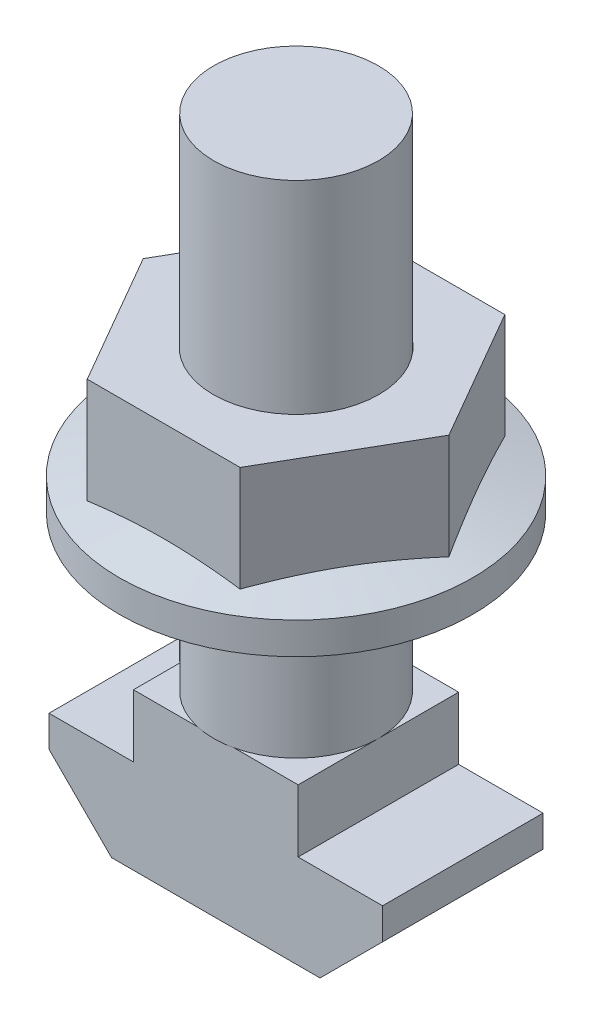
ISO-10303-21;
HEADER;
FILE_DESCRIPTION(('STEP AP214'),'2;1');
FILE_NAME('part.step','',(''),(''),'','','');
FILE_SCHEMA(('AUTOMOTIVE_DESIGN { 1 0 10303 214 1 1 1 1 }'));
ENDSEC;
DATA;
#1=APPLICATION_CONTEXT('core data for automotive mechanical design processes');
#2=APPLICATION_PROTOCOL_DEFINITION('international standard','automotive_design',2000,#1);
#3=PRODUCT_CONTEXT('',#1,'mechanical');
#4=PRODUCT('Part','Part','',(#3));
#5=PRODUCT_RELATED_PRODUCT_CATEGORY('part','',(#4));
#6=PRODUCT_DEFINITION_FORMATION('','',#4);
#7=PRODUCT_DEFINITION_CONTEXT('part definition',#1,'design');
#8=PRODUCT_DEFINITION('design','',#6,#7);
#9=PRODUCT_DEFINITION_SHAPE('','',#8);
#10=(LENGTH_UNIT() NAMED_UNIT(*) SI_UNIT(.MILLI.,.METRE.));
#11=(NAMED_UNIT(*) PLANE_ANGLE_UNIT() SI_UNIT($,.RADIAN.));
#12=(NAMED_UNIT(*) SI_UNIT($,.STERADIAN.) SOLID_ANGLE_UNIT());
#13=UNCERTAINTY_MEASURE_WITH_UNIT(LENGTH_MEASURE(1.E-05),#10,'distance_accuracy_value','');
#14=(GEOMETRIC_REPRESENTATION_CONTEXT(3) GLOBAL_UNCERTAINTY_ASSIGNED_CONTEXT((#13)) GLOBAL_UNIT_ASSIGNED_CONTEXT((#10,
#11,#12)) REPRESENTATION_CONTEXT('',''));
#15=CARTESIAN_POINT('',(0.,0.,0.));
#16=DIRECTION('',(0.,0.,1.));
#17=DIRECTION('',(1.,0.,0.));
#18=AXIS2_PLACEMENT_3D('',#15,#16,#17);
#19=CARTESIAN_POINT('',(7.33234841870825,14.2934,0.));
#20=DIRECTION('',(0.,1.,0.));
#21=DIRECTION('',(0.,0.,1.));
#22=AXIS2_PLACEMENT_3D('',#19,#20,#21);
#23=PLANE('',#22);
#24=DIRECTION('',(0.5,0.,-0.866025403784439));
#25=VECTOR('',#24,1.);
#26=CARTESIAN_POINT('',(3.66617420935412,14.2934,6.35));
#27=LINE('',#26,#25);
#28=CARTESIAN_POINT('',(3.66617420935412,14.2934,6.35));
#29=VERTEX_POINT('',#28);
#30=CARTESIAN_POINT('',(7.33234841870825,14.2934,0.));
#31=VERTEX_POINT('',#30);
#32=EDGE_CURVE('E143',#29,#31,#27,.T.);
#33=ORIENTED_EDGE('',*,*,#32,.T.);
#34=DIRECTION('',(-0.5,0.,-0.866025403784439));
#35=VECTOR('',#34,1.);
#36=CARTESIAN_POINT('',(7.33234841870825,14.2934,0.));
#37=LINE('',#36,#35);
#38=CARTESIAN_POINT('',(3.66617420935412,14.2934,-6.35));
#39=VERTEX_POINT('',#38);
#40=EDGE_CURVE('E140',#31,#39,#37,.T.);
#41=ORIENTED_EDGE('',*,*,#40,.T.);
#42=DIRECTION('',(-1.,0.,0.));
#43=VECTOR('',#42,1.);
#44=CARTESIAN_POINT('',(3.66617420935412,14.2934,-6.35));
#45=LINE('',#44,#43);
#46=CARTESIAN_POINT('',(-3.66617420935412,14.2934,-6.35));
#47=VERTEX_POINT('',#46);
#48=EDGE_CURVE('E233',#39,#47,#45,.T.);
#49=ORIENTED_EDGE('',*,*,#48,.T.);
#50=DIRECTION('',(-0.5,0.,0.866025403784439));
#51=VECTOR('',#50,1.);
#52=CARTESIAN_POINT('',(-3.66617420935412,14.2934,-6.35));
#53=LINE('',#52,#51);
#54=CARTESIAN_POINT('',(-7.33234841870825,14.2934,0.));
#55=VERTEX_POINT('',#54);
#56=EDGE_CURVE('E231',#47,#55,#53,.T.);
#57=ORIENTED_EDGE('',*,*,#56,.T.);
#58=DIRECTION('',(0.5,0.,0.866025403784439));
#59=VECTOR('',#58,1.);
#60=CARTESIAN_POINT('',(-7.33234841870825,14.2934,0.));
#61=LINE('',#60,#59);
#62=CARTESIAN_POINT('',(-3.66617420935413,14.2934,6.35));
#63=VERTEX_POINT('',#62);
#64=EDGE_CURVE('E235',#55,#63,#61,.T.);
#65=ORIENTED_EDGE('',*,*,#64,.T.);
#66=DIRECTION('',(1.,0.,0.));
#67=VECTOR('',#66,1.);
#68=CARTESIAN_POINT('',(-3.66617420935413,14.2934,6.35));
#69=LINE('',#68,#67);
#70=EDGE_CURVE('E73',#63,#29,#69,.T.);
#71=ORIENTED_EDGE('',*,*,#70,.T.);
#72=EDGE_LOOP('',(#33,#41,#49,#57,#65,#71));
#73=FACE_BOUND('',#72,.T.);
#74=CARTESIAN_POINT('',(0.,14.2934,0.));
#75=DIRECTION('',(0.,1.,0.));
#76=DIRECTION('',(0.,0.,1.));
#77=AXIS2_PLACEMENT_3D('',#74,#75,#76);
#78=CIRCLE('',#77,3.96875);
#79=CARTESIAN_POINT('',(0.,14.2934,3.96875));
#80=VERTEX_POINT('',#79);
#81=EDGE_CURVE('E144',#80,#80,#78,.T.);
#82=ORIENTED_EDGE('',*,*,#81,.F.);
#83=EDGE_LOOP('',(#82));
#84=FACE_BOUND('',#83,.T.);
#85=ADVANCED_FACE('F49',(#73,#84),#23,.T.);
#86=CARTESIAN_POINT('',(3.66617420935412,14.2934,6.35));
#87=DIRECTION('',(-0.866025403784439,0.,-0.5));
#88=DIRECTION('',(-0.5,0.,0.866025403784439));
#89=AXIS2_PLACEMENT_3D('',#86,#87,#88);
#90=PLANE('',#89);
#91=DIRECTION('',(0.,-1.,0.));
#92=VECTOR('',#91,1.);
#93=CARTESIAN_POINT('',(3.66617420935412,14.2934,6.35));
#94=LINE('',#93,#92);
#95=CARTESIAN_POINT('',(3.66617420935412,9.2390739767483,6.35));
#96=VERTEX_POINT('',#95);
#97=EDGE_CURVE('E122',#29,#96,#94,.T.);
#98=ORIENTED_EDGE('',*,*,#97,.T.);
#99=CARTESIAN_POINT('',(3.66605873930029,9.23904303590976,6.3502));
#100=CARTESIAN_POINT('',(3.81831531196377,9.27985742440744,6.08648388036055));
#101=CARTESIAN_POINT('',(3.97084794497474,9.31691016800273,5.82228961017329));
#102=CARTESIAN_POINT('',(4.27645189684544,9.38200838104442,5.29296803853939));
#103=CARTESIAN_POINT('',(4.42952340906641,9.41005019183758,5.02784040218128));
#104=CARTESIAN_POINT('',(4.73527703698372,9.45548946289606,4.49825958403));
#105=CARTESIAN_POINT('',(4.8879570851319,9.4729411119343,4.23380998333528));
#106=CARTESIAN_POINT('',(5.19351188913185,9.49634198885274,3.70457353831061));
#107=CARTESIAN_POINT('',(5.34638660158152,9.50229344222716,3.43978676915531));
#108=CARTESIAN_POINT('',(5.65213602648085,9.50229344222716,2.9102132308447));
#109=CARTESIAN_POINT('',(5.80501073893052,9.49634198885274,2.6454264616894));
#110=CARTESIAN_POINT('',(6.11056554293047,9.4729411119343,2.11619001666473));
#111=CARTESIAN_POINT('',(6.26324559107865,9.45548946289606,1.85174041597001));
#112=CARTESIAN_POINT('',(6.56899921899596,9.41005019183758,1.32215959781872));
#113=CARTESIAN_POINT('',(6.72207073121692,9.38200838104442,1.05703196146061));
#114=CARTESIAN_POINT('',(7.02767468308763,9.31691016800273,0.527710389826715));
#115=CARTESIAN_POINT('',(7.1802073160986,9.27985742440744,0.263516119639453));
#116=CARTESIAN_POINT('',(7.33246388876208,9.23904303590976,-0.000199999999998282));
#117=B_SPLINE_CURVE_WITH_KNOTS('',3,(#99,#100,#101,#102,#103,#104,#105,#106,#107,#108,#109,#110,
#111,#112,#113,#114,#115,#116),.UNSPECIFIED.,.F.,.F.,(4,2,2,2,2,2,2,2,4),(0.,0.921756832598808,
1.84388744891418,2.76125893137181,3.67845286820181,4.5956468050318,5.51301828748943,
6.43514890380481,7.35690573640361),.UNSPECIFIED.);
#118=CARTESIAN_POINT('',(7.33234841870825,9.2390739767483,0.));
#119=VERTEX_POINT('',#118);
#120=EDGE_CURVE('E65',#96,#119,#117,.T.);
#121=ORIENTED_EDGE('',*,*,#120,.T.);
#122=DIRECTION('',(0.,-1.,0.));
#123=VECTOR('',#122,1.);
#124=CARTESIAN_POINT('',(7.33234841870825,14.2934,0.));
#125=LINE('',#124,#123);
#126=EDGE_CURVE('E58',#31,#119,#125,.T.);
#127=ORIENTED_EDGE('',*,*,#126,.F.);
#128=ORIENTED_EDGE('',*,*,#32,.F.);
#129=EDGE_LOOP('',(#98,#121,#127,#128));
#130=FACE_BOUND('',#129,.T.);
#131=ADVANCED_FACE('F51',(#130),#90,.F.);
#132=CARTESIAN_POINT('',(7.33234841870825,14.2934,0.));
#133=DIRECTION('',(-0.866025403784439,0.,0.5));
#134=DIRECTION('',(0.5,0.,0.866025403784439));
#135=AXIS2_PLACEMENT_3D('',#132,#133,#134);
#136=PLANE('',#135);
#137=ORIENTED_EDGE('',*,*,#126,.T.);
#138=CARTESIAN_POINT('',(7.33246388876209,9.23904303590976,0.000200000000000096));
#139=CARTESIAN_POINT('',(7.1802073160986,9.27985742440744,-0.263516119639452));
#140=CARTESIAN_POINT('',(7.02767468308763,9.31691016800273,-0.527710389826713));
#141=CARTESIAN_POINT('',(6.72207073121693,9.38200838104442,-1.05703196146061));
#142=CARTESIAN_POINT('',(6.56899921899596,9.41005019183758,-1.32215959781872));
#143=CARTESIAN_POINT('',(6.26324559107865,9.45548946289606,-1.85174041597001));
#144=CARTESIAN_POINT('',(6.11056554293047,9.4729411119343,-2.11619001666473));
#145=CARTESIAN_POINT('',(5.80501073893052,9.49634198885274,-2.64542646168939));
#146=CARTESIAN_POINT('',(5.65213602648085,9.50229344222716,-2.9102132308447));
#147=CARTESIAN_POINT('',(5.34638660158152,9.50229344222716,-3.4397867691553));
#148=CARTESIAN_POINT('',(5.19351188913186,9.49634198885274,-3.70457353831061));
#149=CARTESIAN_POINT('',(4.8879570851319,9.4729411119343,-4.23380998333527));
#150=CARTESIAN_POINT('',(4.73527703698372,9.45548946289606,-4.49825958402999));
#151=CARTESIAN_POINT('',(4.42952340906641,9.41005019183758,-5.02784040218128));
#152=CARTESIAN_POINT('',(4.27645189684545,9.38200838104442,-5.29296803853939));
#153=CARTESIAN_POINT('',(3.97084794497474,9.31691016800273,-5.82228961017329));
#154=CARTESIAN_POINT('',(3.81831531196377,9.27985742440744,-6.08648388036055));
#155=CARTESIAN_POINT('',(3.66605873930029,9.23904303590976,-6.3502));
#156=B_SPLINE_CURVE_WITH_KNOTS('',3,(#138,#139,#140,#141,#142,#143,#144,#145,#146,#147,#148,
#149,#150,#151,#152,#153,#154,#155),.UNSPECIFIED.,.F.,.F.,(4,2,2,2,2,2,2,2,4),(0.,
0.921756832598808,1.84388744891418,2.76125893137181,3.67845286820181,4.5956468050318,
5.51301828748943,6.43514890380481,7.35690573640361),.UNSPECIFIED.);
#157=CARTESIAN_POINT('',(3.66617420935412,9.2390739767483,-6.35));
#158=VERTEX_POINT('',#157);
#159=EDGE_CURVE('E139',#119,#158,#156,.T.);
#160=ORIENTED_EDGE('',*,*,#159,.T.);
#161=DIRECTION('',(0.,-1.,0.));
#162=VECTOR('',#161,1.);
#163=CARTESIAN_POINT('',(3.66617420935412,14.2934,-6.35));
#164=LINE('',#163,#162);
#165=EDGE_CURVE('E131',#39,#158,#164,.T.);
#166=ORIENTED_EDGE('',*,*,#165,.F.);
#167=ORIENTED_EDGE('',*,*,#40,.F.);
#168=EDGE_LOOP('',(#137,#160,#166,#167));
#169=FACE_BOUND('',#168,.T.);
#170=ADVANCED_FACE('F137',(#169),#136,.F.);
#171=CARTESIAN_POINT('',(3.66617420935412,14.2934,-6.35));
#172=DIRECTION('',(0.,0.,1.));
#173=DIRECTION('',(1.,0.,0.));
#174=AXIS2_PLACEMENT_3D('',#171,#172,#173);
#175=PLANE('',#174);
#176=ORIENTED_EDGE('',*,*,#165,.T.);
#177=CARTESIAN_POINT('',(-9.66303360232362,8.10554672545548,-6.35));
#178=CARTESIAN_POINT('',(-9.37531819608699,8.16995641409853,-6.35));
#179=CARTESIAN_POINT('',(-9.08742183021272,8.23357234346598,-6.35));
#180=CARTESIAN_POINT('',(-8.51117836739836,8.35878821533182,-6.35));
#181=CARTESIAN_POINT('',(-8.22283125130946,8.42038806960218,-6.35));
#182=CARTESIAN_POINT('',(-7.64533564923513,8.54119764892656,-6.35));
#183=CARTESIAN_POINT('',(-7.35618665151456,8.60040493654918,-6.35));
#184=CARTESIAN_POINT('',(-6.77728414268363,8.71578476055538,-6.35));
#185=CARTESIAN_POINT('',(-6.48753063677929,8.7719573229629,-6.35));
#186=CARTESIAN_POINT('',(-5.90970313916575,8.88009829288303,-6.35));
#187=CARTESIAN_POINT('',(-5.62163493667101,8.93209748074949,-6.35));
#188=CARTESIAN_POINT('',(-5.04471088446565,9.03151722655079,-6.35));
#189=CARTESIAN_POINT('',(-4.75585505239382,9.07893788616875,-6.35));
#190=CARTESIAN_POINT('',(-4.17730272139076,9.1681257516916,-6.35));
#191=CARTESIAN_POINT('',(-3.88760633666564,9.20989369197672,-6.35));
#192=CARTESIAN_POINT('',(-3.30729300198243,9.28653889149397,-6.35));
#193=CARTESIAN_POINT('',(-3.01667605133965,9.32141614559991,-6.35));
#194=CARTESIAN_POINT('',(-2.43124946511637,9.38328591916549,-6.35));
#195=CARTESIAN_POINT('',(-2.1364297283366,9.41018428191343,-6.35));
#196=CARTESIAN_POINT('',(-1.54605682889553,9.45423499968562,-6.35));
#197=CARTESIAN_POINT('',(-1.25050368324146,9.4713875786252,-6.35));
#198=CARTESIAN_POINT('',(-0.659093954044362,9.49494605907683,-6.35));
#199=CARTESIAN_POINT('',(-0.36323756714733,9.50135679781985,-6.35));
#200=CARTESIAN_POINT('',(0.228507453574778,9.50303860114522,-6.35));
#201=CARTESIAN_POINT('',(0.524396087394284,9.49830966764851,-6.35));
#202=CARTESIAN_POINT('',(1.11692285464838,9.47797618634426,-6.35));
#203=CARTESIAN_POINT('',(1.4135595366741,9.46233018586095,-6.35));
#204=CARTESIAN_POINT('',(2.00613062338102,9.42105018429308,-6.35));
#205=CARTESIAN_POINT('',(2.30206501257119,9.39541596491325,-6.35));
#206=CARTESIAN_POINT('',(2.8932328087299,9.33544561693354,-6.35));
#207=CARTESIAN_POINT('',(3.18846563030427,9.30110380525454,-6.35));
#208=CARTESIAN_POINT('',(3.77798197443811,9.2251367292199,-6.35));
#209=CARTESIAN_POINT('',(4.07226549497961,9.18351144939194,-6.35));
#210=CARTESIAN_POINT('',(4.65165510973276,9.09555353132328,-6.35));
#211=CARTESIAN_POINT('',(4.93678654258319,9.04938620768166,-6.35));
#212=CARTESIAN_POINT('',(5.50627336380907,8.95246850280279,-6.35));
#213=CARTESIAN_POINT('',(5.79062872816322,8.90171798132468,-6.35));
#214=CARTESIAN_POINT('',(6.35867755067836,8.79650210863113,-6.35));
#215=CARTESIAN_POINT('',(6.64237093923002,8.7420363834768,-6.35));
#216=CARTESIAN_POINT('',(7.20916407103406,8.63009167674622,-6.35));
#217=CARTESIAN_POINT('',(7.49226380612494,8.57261265402228,-6.35));
#218=CARTESIAN_POINT('',(8.34095395905756,8.39649751899766,-6.35));
#219=CARTESIAN_POINT('',(8.90578606466009,8.27421164570989,-6.35));
#220=CARTESIAN_POINT('',(10.0339469413521,8.02312781256023,-6.35));
#221=CARTESIAN_POINT('',(10.5972758078774,7.89433027698228,-6.35));
#222=CARTESIAN_POINT('',(11.7168438177758,7.63359340333414,-6.35));
#223=CARTESIAN_POINT('',(12.2730942703584,7.50170249420661,-6.35));
#224=CARTESIAN_POINT('',(13.3848366872236,7.23472273339603,-6.35));
#225=CARTESIAN_POINT('',(13.9403286359995,7.09963381733923,-6.35));
#226=CARTESIAN_POINT('',(15.0500080737051,6.82728571898805,-6.35));
#227=CARTESIAN_POINT('',(15.6041963183085,6.69002960970446,-6.35));
#228=CARTESIAN_POINT('',(16.7121042300174,6.41371843474742,-6.35));
#229=CARTESIAN_POINT('',(17.2658239125768,6.27466343108149,-6.35));
#230=CARTESIAN_POINT('',(17.8193820921471,6.1349760178163,-6.35));
#231=B_SPLINE_CURVE_WITH_KNOTS('',3,(#177,#178,#179,#180,#181,#182,#183,#184,#185,#186,#187,
#188,#189,#190,#191,#192,#193,#194,#195,#196,#197,#198,#199,#200,#201,#202,#203,#204,#205,#206,
#207,#208,#209,#210,#211,#212,#213,#214,#215,#216,#217,#218,#219,#220,#221,#222,#223,#224,#225,
#226,#227,#228,#229,#230),.UNSPECIFIED.,.F.,.F.,(4,2,2,2,2,2,2,2,2,2,2,2,2,2,2,2,2,2,2,2,2,2,2,
2,2,2,4),(0.,0.884514171447776,1.76906699962808,2.65449934793776,3.53992410211414,
4.4180658897917,5.29618817059958,6.17419625929415,7.0522050011638,7.94019654615765,
8.82816768817946,9.71573885431787,10.603309867401,11.4942695049803,12.3852486158187,
13.2768107348017,14.1683747477589,15.0348642947957,15.9013803644585,16.7679837788744,
17.6345990301679,19.3682852220964,21.1018585965078,22.8168634515226,24.531902857842,
26.2446968291066,27.9574319171987),.UNSPECIFIED.);
#232=CARTESIAN_POINT('',(-3.66617420935412,9.2390739767483,-6.35));
#233=VERTEX_POINT('',#232);
#234=EDGE_CURVE('E148',#158,#233,#231,.F.);
#235=ORIENTED_EDGE('',*,*,#234,.T.);
#236=DIRECTION('',(0.,-1.,0.));
#237=VECTOR('',#236,1.);
#238=CARTESIAN_POINT('',(-3.66617420935412,14.2934,-6.35));
#239=LINE('',#238,#237);
#240=EDGE_CURVE('E124',#47,#233,#239,.T.);
#241=ORIENTED_EDGE('',*,*,#240,.F.);
#242=ORIENTED_EDGE('',*,*,#48,.F.);
#243=EDGE_LOOP('',(#176,#235,#241,#242));
#244=FACE_BOUND('',#243,.T.);
#245=ADVANCED_FACE('F199',(#244),#175,.F.);
#246=CARTESIAN_POINT('',(-3.66617420935412,14.2934,-6.35));
#247=DIRECTION('',(0.866025403784439,0.,0.5));
#248=DIRECTION('',(0.5,0.,-0.866025403784439));
#249=AXIS2_PLACEMENT_3D('',#246,#247,#248);
#250=PLANE('',#249);
#251=ORIENTED_EDGE('',*,*,#240,.T.);
#252=CARTESIAN_POINT('',(-3.66605873930029,9.23904303590976,-6.3502));
#253=CARTESIAN_POINT('',(-3.81831531196377,9.27985742440744,-6.08648388036055));
#254=CARTESIAN_POINT('',(-3.97084794497474,9.31691016800273,-5.82228961017329));
#255=CARTESIAN_POINT('',(-4.27645189684544,9.38200838104442,-5.29296803853939));
#256=CARTESIAN_POINT('',(-4.42952340906641,9.41005019183758,-5.02784040218128));
#257=CARTESIAN_POINT('',(-4.73527703698372,9.45548946289606,-4.49825958403));
#258=CARTESIAN_POINT('',(-4.8879570851319,9.4729411119343,-4.23380998333527));
#259=CARTESIAN_POINT('',(-5.19351188913185,9.49634198885274,-3.70457353831061));
#260=CARTESIAN_POINT('',(-5.34638660158152,9.50229344222716,-3.43978676915531));
#261=CARTESIAN_POINT('',(-5.65213602648085,9.50229344222716,-2.9102132308447));
#262=CARTESIAN_POINT('',(-5.80501073893052,9.49634198885274,-2.6454264616894));
#263=CARTESIAN_POINT('',(-6.11056554293047,9.4729411119343,-2.11619001666473));
#264=CARTESIAN_POINT('',(-6.26324559107865,9.45548946289606,-1.85174041597001));
#265=CARTESIAN_POINT('',(-6.56899921899596,9.41005019183758,-1.32215959781872));
#266=CARTESIAN_POINT('',(-6.72207073121693,9.38200838104442,-1.05703196146061));
#267=CARTESIAN_POINT('',(-7.02767468308763,9.31691016800273,-0.527710389826714));
#268=CARTESIAN_POINT('',(-7.18020731609861,9.27985742440744,-0.263516119639454));
#269=CARTESIAN_POINT('',(-7.33246388876209,9.23904303590976,0.000199999999999103));
#270=B_SPLINE_CURVE_WITH_KNOTS('',3,(#252,#253,#254,#255,#256,#257,#258,#259,#260,#261,#262,
#263,#264,#265,#266,#267,#268,#269),.UNSPECIFIED.,.F.,.F.,(4,2,2,2,2,2,2,2,4),(0.,
0.921756832598808,1.84388744891418,2.76125893137181,3.67845286820181,4.59564680503181,
5.51301828748943,6.43514890380481,7.35690573640362),.UNSPECIFIED.);
#271=CARTESIAN_POINT('',(-7.33234841870825,9.2390739767483,0.));
#272=VERTEX_POINT('',#271);
#273=EDGE_CURVE('E119',#233,#272,#270,.T.);
#274=ORIENTED_EDGE('',*,*,#273,.T.);
#275=DIRECTION('',(0.,-1.,0.));
#276=VECTOR('',#275,1.);
#277=CARTESIAN_POINT('',(-7.33234841870825,14.2934,0.));
#278=LINE('',#277,#276);
#279=EDGE_CURVE('E118',#55,#272,#278,.T.);
#280=ORIENTED_EDGE('',*,*,#279,.F.);
#281=ORIENTED_EDGE('',*,*,#56,.F.);
#282=EDGE_LOOP('',(#251,#274,#280,#281));
#283=FACE_BOUND('',#282,.T.);
#284=ADVANCED_FACE('F202',(#283),#250,.F.);
#285=CARTESIAN_POINT('',(-7.33234841870825,14.2934,0.));
#286=DIRECTION('',(0.866025403784439,0.,-0.5));
#287=DIRECTION('',(-0.5,0.,-0.866025403784439));
#288=AXIS2_PLACEMENT_3D('',#285,#286,#287);
#289=PLANE('',#288);
#290=ORIENTED_EDGE('',*,*,#279,.T.);
#291=CARTESIAN_POINT('',(-7.33246388876209,9.23904303590976,-0.000200000000000783));
#292=CARTESIAN_POINT('',(-7.1802073160986,9.27985742440744,0.263516119639452));
#293=CARTESIAN_POINT('',(-7.02767468308763,9.31691016800273,0.527710389826713));
#294=CARTESIAN_POINT('',(-6.72207073121693,9.38200838104442,1.05703196146061));
#295=CARTESIAN_POINT('',(-6.56899921899596,9.41005019183758,1.32215959781872));
#296=CARTESIAN_POINT('',(-6.26324559107866,9.45548946289606,1.85174041597001));
#297=CARTESIAN_POINT('',(-6.11056554293047,9.4729411119343,2.11619001666473));
#298=CARTESIAN_POINT('',(-5.80501073893052,9.49634198885274,2.64542646168939));
#299=CARTESIAN_POINT('',(-5.65213602648085,9.50229344222716,2.9102132308447));
#300=CARTESIAN_POINT('',(-5.34638660158152,9.50229344222716,3.4397867691553));
#301=CARTESIAN_POINT('',(-5.19351188913186,9.49634198885274,3.70457353831061));
#302=CARTESIAN_POINT('',(-4.88795708513191,9.4729411119343,4.23380998333527));
#303=CARTESIAN_POINT('',(-4.73527703698372,9.45548946289606,4.49825958402999));
#304=CARTESIAN_POINT('',(-4.42952340906641,9.41005019183758,5.02784040218128));
#305=CARTESIAN_POINT('',(-4.27645189684545,9.38200838104442,5.29296803853939));
#306=CARTESIAN_POINT('',(-3.97084794497474,9.31691016800273,5.82228961017329));
#307=CARTESIAN_POINT('',(-3.81831531196377,9.27985742440744,6.08648388036055));
#308=CARTESIAN_POINT('',(-3.66605873930029,9.23904303590976,6.3502));
#309=B_SPLINE_CURVE_WITH_KNOTS('',3,(#291,#292,#293,#294,#295,#296,#297,#298,#299,#300,#301,
#302,#303,#304,#305,#306,#307,#308),.UNSPECIFIED.,.F.,.F.,(4,2,2,2,2,2,2,2,4),(0.,
0.921756832598809,1.84388744891418,2.76125893137181,3.67845286820181,4.5956468050318,
5.51301828748943,6.43514890380481,7.35690573640361),.UNSPECIFIED.);
#310=CARTESIAN_POINT('',(-3.66617420935413,9.2390739767483,6.35));
#311=VERTEX_POINT('',#310);
#312=EDGE_CURVE('E104',#272,#311,#309,.T.);
#313=ORIENTED_EDGE('',*,*,#312,.T.);
#314=DIRECTION('',(0.,-1.,0.));
#315=VECTOR('',#314,1.);
#316=CARTESIAN_POINT('',(-3.66617420935413,14.2934,6.35));
#317=LINE('',#316,#315);
#318=EDGE_CURVE('E116',#63,#311,#317,.T.);
#319=ORIENTED_EDGE('',*,*,#318,.F.);
#320=ORIENTED_EDGE('',*,*,#64,.F.);
#321=EDGE_LOOP('',(#290,#313,#319,#320));
#322=FACE_BOUND('',#321,.T.);
#323=ADVANCED_FACE('F114',(#322),#289,.F.);
#324=CARTESIAN_POINT('',(-3.66617420935413,14.2934,6.35));
#325=DIRECTION('',(0.,0.,-1.));
#326=DIRECTION('',(-1.,0.,0.));
#327=AXIS2_PLACEMENT_3D('',#324,#325,#326);
#328=PLANE('',#327);
#329=ORIENTED_EDGE('',*,*,#318,.T.);
#330=CARTESIAN_POINT('',(-9.66303360232363,8.10554672545548,6.35));
#331=CARTESIAN_POINT('',(-9.375318196087,8.16995641409853,6.35));
#332=CARTESIAN_POINT('',(-9.08742183021272,8.23357234346598,6.35));
#333=CARTESIAN_POINT('',(-8.51117836739836,8.35878821533182,6.35));
#334=CARTESIAN_POINT('',(-8.22283125130946,8.42038806960218,6.35));
#335=CARTESIAN_POINT('',(-7.64533564923514,8.54119764892656,6.35));
#336=CARTESIAN_POINT('',(-7.35618665151457,8.60040493654918,6.35));
#337=CARTESIAN_POINT('',(-6.77728414268363,8.71578476055538,6.35));
#338=CARTESIAN_POINT('',(-6.4875306367793,8.7719573229629,6.35));
#339=CARTESIAN_POINT('',(-5.90970313916576,8.88009829288303,6.35));
#340=CARTESIAN_POINT('',(-5.62163493667102,8.93209748074949,6.35));
#341=CARTESIAN_POINT('',(-5.04471088446566,9.03151722655079,6.35));
#342=CARTESIAN_POINT('',(-4.75585505239383,9.07893788616875,6.35));
#343=CARTESIAN_POINT('',(-4.17730272139076,9.1681257516916,6.35));
#344=CARTESIAN_POINT('',(-3.88760633666565,9.20989369197672,6.35));
#345=CARTESIAN_POINT('',(-3.30729300198243,9.28653889149397,6.35));
#346=CARTESIAN_POINT('',(-3.01667605133965,9.32141614559991,6.35));
#347=CARTESIAN_POINT('',(-2.43124946511637,9.38328591916549,6.35));
#348=CARTESIAN_POINT('',(-2.1364297283366,9.41018428191343,6.35));
#349=CARTESIAN_POINT('',(-1.54605682889553,9.45423499968562,6.35));
#350=CARTESIAN_POINT('',(-1.25050368324146,9.4713875786252,6.35));
#351=CARTESIAN_POINT('',(-0.659093954044366,9.49494605907683,6.35));
#352=CARTESIAN_POINT('',(-0.363237567147333,9.50135679781985,6.35));
#353=CARTESIAN_POINT('',(0.228507453574775,9.50303860114522,6.35));
#354=CARTESIAN_POINT('',(0.524396087394281,9.49830966764851,6.35));
#355=CARTESIAN_POINT('',(1.11692285464838,9.47797618634426,6.35));
#356=CARTESIAN_POINT('',(1.4135595366741,9.46233018586095,6.35));
#357=CARTESIAN_POINT('',(2.00613062338102,9.42105018429308,6.35));
#358=CARTESIAN_POINT('',(2.30206501257119,9.39541596491325,6.35));
#359=CARTESIAN_POINT('',(2.8932328087299,9.33544561693354,6.35));
#360=CARTESIAN_POINT('',(3.18846563030427,9.30110380525454,6.35));
#361=CARTESIAN_POINT('',(3.7779819744381,9.2251367292199,6.35));
#362=CARTESIAN_POINT('',(4.07226549497961,9.18351144939194,6.35));
#363=CARTESIAN_POINT('',(4.65165510973276,9.09555353132328,6.35));
#364=CARTESIAN_POINT('',(4.93678654258318,9.04938620768166,6.35));
#365=CARTESIAN_POINT('',(5.50627336380906,8.95246850280279,6.35));
#366=CARTESIAN_POINT('',(5.79062872816321,8.90171798132468,6.35));
#367=CARTESIAN_POINT('',(6.35867755067835,8.79650210863113,6.35));
#368=CARTESIAN_POINT('',(6.64237093923002,8.7420363834768,6.35));
#369=CARTESIAN_POINT('',(7.20916407103406,8.63009167674623,6.35));
#370=CARTESIAN_POINT('',(7.49226380612494,8.57261265402228,6.35));
#371=CARTESIAN_POINT('',(8.34095395905756,8.39649751899766,6.35));
#372=CARTESIAN_POINT('',(8.90578606466008,8.27421164570989,6.35));
#373=CARTESIAN_POINT('',(10.0339469413521,8.02312781256023,6.35));
#374=CARTESIAN_POINT('',(10.5972758078774,7.89433027698228,6.35));
#375=CARTESIAN_POINT('',(11.7168438177758,7.63359340333414,6.35));
#376=CARTESIAN_POINT('',(12.2730942703584,7.50170249420661,6.35000000000001));
#377=CARTESIAN_POINT('',(13.3848366872236,7.23472273339603,6.35000000000001));
#378=CARTESIAN_POINT('',(13.9403286359995,7.09963381733923,6.35000000000001));
#379=CARTESIAN_POINT('',(15.0500080737051,6.82728571898805,6.35000000000001));
#380=CARTESIAN_POINT('',(15.6041963183085,6.69002960970446,6.35000000000001));
#381=CARTESIAN_POINT('',(16.7121042300174,6.41371843474742,6.35000000000001));
#382=CARTESIAN_POINT('',(17.2658239125768,6.27466343108149,6.35000000000001));
#383=CARTESIAN_POINT('',(17.8193820921471,6.1349760178163,6.35000000000001));
#384=B_SPLINE_CURVE_WITH_KNOTS('',3,(#330,#331,#332,#333,#334,#335,#336,#337,#338,#339,#340,
#341,#342,#343,#344,#345,#346,#347,#348,#349,#350,#351,#352,#353,#354,#355,#356,#357,#358,#359,
#360,#361,#362,#363,#364,#365,#366,#367,#368,#369,#370,#371,#372,#373,#374,#375,#376,#377,#378,
#379,#380,#381,#382,#383),.UNSPECIFIED.,.F.,.F.,(4,2,2,2,2,2,2,2,2,2,2,2,2,2,2,2,2,2,2,2,2,2,2,
2,2,2,4),(0.,0.884514171447776,1.76906699962808,2.65449934793776,3.53992410211414,
4.4180658897917,5.29618817059958,6.17419625929415,7.05220500116381,7.94019654615765,
8.82816768817946,9.71573885431787,10.603309867401,11.4942695049803,12.3852486158187,
13.2768107348017,14.1683747477589,15.0348642947957,15.9013803644585,16.7679837788744,
17.6345990301679,19.3682852220964,21.1018585965078,22.8168634515226,24.531902857842,
26.2446968291066,27.9574319171987),.UNSPECIFIED.);
#385=EDGE_CURVE('E101',#311,#96,#384,.T.);
#386=ORIENTED_EDGE('',*,*,#385,.T.);
#387=ORIENTED_EDGE('',*,*,#97,.F.);
#388=ORIENTED_EDGE('',*,*,#70,.F.);
#389=EDGE_LOOP('',(#329,#386,#387,#388));
#390=FACE_BOUND('',#389,.T.);
#391=ADVANCED_FACE('F121',(#390),#328,.F.);
#392=CARTESIAN_POINT('',(0.,14.2934,0.));
#393=DIRECTION('',(0.,-1.,0.));
#394=DIRECTION('',(0.,0.,-1.));
#395=AXIS2_PLACEMENT_3D('',#392,#393,#394);
#396=CYLINDRICAL_SURFACE('',#395,3.96875);
#397=CARTESIAN_POINT('',(0.,10.1403474567038,0.));
#398=DIRECTION('',(0.,-1.,0.));
#399=DIRECTION('',(0.,0.,-1.));
#400=AXIS2_PLACEMENT_3D('',#397,#398,#399);
#401=CIRCLE('',#400,3.96875);
#402=CARTESIAN_POINT('',(0.,10.1403474567038,-3.96875));
#403=VERTEX_POINT('',#402);
#404=EDGE_CURVE('E12',#403,#403,#401,.F.);
#405=ORIENTED_EDGE('',*,*,#404,.F.);
#406=EDGE_LOOP('',(#405));
#407=FACE_BOUND('',#406,.T.);
#408=ORIENTED_EDGE('',*,*,#81,.T.);
#409=EDGE_LOOP('',(#408));
#410=FACE_BOUND('',#409,.T.);
#411=ADVANCED_FACE('F167',(#407,#410),#396,.F.);
#412=CARTESIAN_POINT('',(0.,10.2214223954565,0.));
#413=DIRECTION('',(0.,-1.,0.));
#414=DIRECTION('',(0.,0.,-1.));
#415=AXIS2_PLACEMENT_3D('',#412,#413,#414);
#416=CONICAL_SURFACE('',#415,3.66617420935412,1.30899693899575);
#417=ORIENTED_EDGE('',*,*,#404,.T.);
#418=EDGE_LOOP('',(#417));
#419=FACE_BOUND('',#418,.T.);
#420=CARTESIAN_POINT('',(0.,10.2214223954565,0.));
#421=DIRECTION('',(0.,1.,0.));
#422=DIRECTION('',(0.,0.,1.));
#423=AXIS2_PLACEMENT_3D('',#420,#421,#422);
#424=CIRCLE('',#423,3.66617420935412);
#425=CARTESIAN_POINT('',(0.,10.2214223954565,3.66617420935412));
#426=VERTEX_POINT('',#425);
#427=EDGE_CURVE('E109',#426,#426,#424,.T.);
#428=ORIENTED_EDGE('',*,*,#427,.F.);
#429=EDGE_LOOP('',(#428));
#430=FACE_BOUND('',#429,.T.);
#431=ADVANCED_FACE('F161',(#419,#430),#416,.T.);
#432=CARTESIAN_POINT('',(0.,24.,0.));
#433=DIRECTION('',(0.,1.,0.));
#434=DIRECTION('',(0.,0.,1.));
#435=AXIS2_PLACEMENT_3D('',#432,#433,#434);
#436=CYLINDRICAL_SURFACE('',#435,3.66617420935412);
#437=ORIENTED_EDGE('',*,*,#427,.T.);
#438=EDGE_LOOP('',(#437));
#439=FACE_BOUND('',#438,.T.);
#440=CARTESIAN_POINT('',(0.,7.41,0.));
#441=DIRECTION('',(0.,1.,0.));
#442=DIRECTION('',(0.,0.,1.));
#443=AXIS2_PLACEMENT_3D('',#440,#441,#442);
#444=CIRCLE('',#443,3.66617420935412);
#445=CARTESIAN_POINT('',(0.,7.41,3.66617420935412));
#446=VERTEX_POINT('',#445);
#447=EDGE_CURVE('E333',#446,#446,#444,.T.);
#448=ORIENTED_EDGE('',*,*,#447,.F.);
#449=EDGE_LOOP('',(#448));
#450=FACE_BOUND('',#449,.T.);
#451=ADVANCED_FACE('F166',(#439,#450),#436,.F.);
#452=CARTESIAN_POINT('',(0.,8.934,0.));
#453=DIRECTION('',(0.,1.,0.));
#454=DIRECTION('',(0.,0.,1.));
#455=AXIS2_PLACEMENT_3D('',#452,#453,#454);
#456=CIRCLE('',#455,8.4709);
#457=CARTESIAN_POINT('',(0.,8.934,8.4709));
#458=VERTEX_POINT('',#457);
#459=EDGE_CURVE('E326',#458,#458,#456,.T.);
#460=ORIENTED_EDGE('',*,*,#459,.T.);
#461=EDGE_LOOP('',(#460));
#462=FACE_BOUND('',#461,.T.);
#463=ORIENTED_EDGE('',*,*,#120,.F.);
#464=ORIENTED_EDGE('',*,*,#385,.F.);
#465=ORIENTED_EDGE('',*,*,#312,.F.);
#466=ORIENTED_EDGE('',*,*,#273,.F.);
#467=ORIENTED_EDGE('',*,*,#234,.F.);
#468=ORIENTED_EDGE('',*,*,#159,.F.);
#469=EDGE_LOOP('',(#463,#464,#465,#466,#467,#468));
#470=FACE_BOUND('',#469,.T.);
#471=ADVANCED_FACE('F103',(#462,#470),#416,.T.);
#472=CARTESIAN_POINT('',(0.,24.,0.));
#473=DIRECTION('',(0.,1.,0.));
#474=DIRECTION('',(0.,0.,1.));
#475=AXIS2_PLACEMENT_3D('',#472,#473,#474);
#476=CYLINDRICAL_SURFACE('',#475,8.4709);
#477=CARTESIAN_POINT('',(0.,7.41,0.));
#478=DIRECTION('',(0.,1.,0.));
#479=DIRECTION('',(0.,0.,1.));
#480=AXIS2_PLACEMENT_3D('',#477,#478,#479);
#481=CIRCLE('',#480,8.4709);
#482=CARTESIAN_POINT('',(0.,7.41,8.4709));
#483=VERTEX_POINT('',#482);
#484=EDGE_CURVE('E328',#483,#483,#481,.T.);
#485=ORIENTED_EDGE('',*,*,#484,.T.);
#486=EDGE_LOOP('',(#485));
#487=FACE_BOUND('',#486,.T.);
#488=ORIENTED_EDGE('',*,*,#459,.F.);
#489=EDGE_LOOP('',(#488));
#490=FACE_BOUND('',#489,.T.);
#491=ADVANCED_FACE('F169',(#487,#490),#476,.T.);
#492=CARTESIAN_POINT('',(7.33234841870825,7.41,0.));
#493=DIRECTION('',(0.,1.,0.));
#494=DIRECTION('',(0.,0.,1.));
#495=AXIS2_PLACEMENT_3D('',#492,#493,#494);
#496=PLANE('',#495);
#497=ORIENTED_EDGE('',*,*,#447,.T.);
#498=EDGE_LOOP('',(#497));
#499=FACE_BOUND('',#498,.T.);
#500=ORIENTED_EDGE('',*,*,#484,.F.);
#501=EDGE_LOOP('',(#500));
#502=FACE_BOUND('',#501,.T.);
#503=ADVANCED_FACE('F216',(#499,#502),#496,.F.);
#504=CLOSED_SHELL('',(#85,#131,#170,#245,#284,#323,#391,#411,#431,#451,#471,#491,#503));
#505=MANIFOLD_SOLID_BREP('B2',#504);
#506=CARTESIAN_POINT('',(0.,0.,0.));
#507=DIRECTION('',(0.,1.,0.));
#508=DIRECTION('',(0.,0.,1.));
#509=AXIS2_PLACEMENT_3D('',#506,#507,#508);
#510=PLANE('',#509);
#511=DIRECTION('',(-1.,0.,0.));
#512=VECTOR('',#511,1.);
#513=CARTESIAN_POINT('',(-3.949999974,0.,3.85));
#514=LINE('',#513,#512);
#515=CARTESIAN_POINT('',(0.883176086632785,0.,3.85));
#516=VERTEX_POINT('',#515);
#517=CARTESIAN_POINT('',(-0.883176086632785,0.,3.85));
#518=VERTEX_POINT('',#517);
#519=EDGE_CURVE('E353',#516,#518,#514,.T.);
#520=ORIENTED_EDGE('',*,*,#519,.F.);
#521=CARTESIAN_POINT('',(0.,0.,0.));
#522=DIRECTION('',(0.,1.,0.));
#523=DIRECTION('',(0.,0.,1.));
#524=AXIS2_PLACEMENT_3D('',#521,#522,#523);
#525=CIRCLE('',#524,3.95);
#526=EDGE_CURVE('E466',#518,#516,#525,.T.);
#527=ORIENTED_EDGE('',*,*,#526,.F.);
#528=EDGE_LOOP('',(#520,#527));
#529=FACE_BOUND('',#528,.T.);
#530=ADVANCED_FACE('F344',(#529),#510,.F.);
#531=CARTESIAN_POINT('',(0.,24.,0.));
#532=DIRECTION('',(0.,-1.,0.));
#533=DIRECTION('',(0.,0.,-1.));
#534=AXIS2_PLACEMENT_3D('',#531,#532,#533);
#535=CYLINDRICAL_SURFACE('',#534,3.95);
#536=CARTESIAN_POINT('',(0.,24.,0.));
#537=DIRECTION('',(0.,1.,0.));
#538=DIRECTION('',(0.,0.,1.));
#539=AXIS2_PLACEMENT_3D('',#536,#537,#538);
#540=CIRCLE('',#539,3.95);
#541=CARTESIAN_POINT('',(0.,24.,3.95));
#542=VERTEX_POINT('',#541);
#543=EDGE_CURVE('E473',#542,#542,#540,.T.);
#544=ORIENTED_EDGE('',*,*,#543,.F.);
#545=EDGE_LOOP('',(#544));
#546=FACE_BOUND('',#545,.T.);
#547=CARTESIAN_POINT('',(3.949999974,0.,0.));
#548=VERTEX_POINT('',#547);
#549=EDGE_CURVE('E348',#516,#548,#525,.T.);
#550=ORIENTED_EDGE('',*,*,#549,.T.);
#551=CARTESIAN_POINT('',(0.883176086632785,0.,-3.85));
#552=VERTEX_POINT('',#551);
#553=EDGE_CURVE('E479',#548,#552,#525,.T.);
#554=ORIENTED_EDGE('',*,*,#553,.T.);
#555=CARTESIAN_POINT('',(-0.883176086632785,0.,-3.85));
#556=VERTEX_POINT('',#555);
#557=EDGE_CURVE('E483',#552,#556,#525,.T.);
#558=ORIENTED_EDGE('',*,*,#557,.T.);
#559=CARTESIAN_POINT('',(-3.949999974,0.,0.));
#560=VERTEX_POINT('',#559);
#561=EDGE_CURVE('E363',#556,#560,#525,.T.);
#562=ORIENTED_EDGE('',*,*,#561,.T.);
#563=EDGE_CURVE('E469',#560,#518,#525,.T.);
#564=ORIENTED_EDGE('',*,*,#563,.T.);
#565=ORIENTED_EDGE('',*,*,#526,.T.);
#566=EDGE_LOOP('',(#550,#554,#558,#562,#564,#565));
#567=FACE_BOUND('',#566,.T.);
#568=ADVANCED_FACE('F346',(#546,#567),#535,.T.);
#569=CARTESIAN_POINT('',(0.,24.,0.));
#570=DIRECTION('',(0.,1.,0.));
#571=DIRECTION('',(0.,0.,1.));
#572=AXIS2_PLACEMENT_3D('',#569,#570,#571);
#573=PLANE('',#572);
#574=ORIENTED_EDGE('',*,*,#543,.T.);
#575=EDGE_LOOP('',(#574));
#576=FACE_BOUND('',#575,.T.);
#577=ADVANCED_FACE('F591',(#576),#573,.T.);
#578=ORIENTED_EDGE('',*,*,#557,.F.);
#579=DIRECTION('',(-1.,0.,0.));
#580=VECTOR('',#579,1.);
#581=CARTESIAN_POINT('',(-3.949999974,0.,-3.85));
#582=LINE('',#581,#580);
#583=EDGE_CURVE('E47',#552,#556,#582,.T.);
#584=ORIENTED_EDGE('',*,*,#583,.T.);
#585=EDGE_LOOP('',(#578,#584));
#586=FACE_BOUND('',#585,.T.);
#587=ADVANCED_FACE('F583',(#586),#510,.F.);
#588=CARTESIAN_POINT('',(-3.949999974,0.,3.85));
#589=DIRECTION('',(0.,-1.,0.));
#590=DIRECTION('',(1.,0.,0.));
#591=AXIS2_PLACEMENT_3D('',#588,#589,#590);
#592=PLANE('',#591);
#593=ORIENTED_EDGE('',*,*,#549,.F.);
#594=CARTESIAN_POINT('',(3.949999974,0.,3.85));
#595=VERTEX_POINT('',#594);
#596=EDGE_CURVE('E478',#595,#516,#514,.T.);
#597=ORIENTED_EDGE('',*,*,#596,.F.);
#598=DIRECTION('',(0.,0.,-1.));
#599=VECTOR('',#598,1.);
#600=CARTESIAN_POINT('',(3.949999974,0.,3.85));
#601=LINE('',#600,#599);
#602=EDGE_CURVE('E522',#595,#548,#601,.T.);
#603=ORIENTED_EDGE('',*,*,#602,.T.);
#604=EDGE_LOOP('',(#593,#597,#603));
#605=FACE_BOUND('',#604,.T.);
#606=ADVANCED_FACE('F580',(#605),#592,.F.);
#607=ORIENTED_EDGE('',*,*,#553,.F.);
#608=CARTESIAN_POINT('',(3.949999974,0.,-3.85));
#609=VERTEX_POINT('',#608);
#610=EDGE_CURVE('E521',#548,#609,#601,.T.);
#611=ORIENTED_EDGE('',*,*,#610,.T.);
#612=EDGE_CURVE('E355',#609,#552,#582,.T.);
#613=ORIENTED_EDGE('',*,*,#612,.T.);
#614=EDGE_LOOP('',(#607,#611,#613));
#615=FACE_BOUND('',#614,.T.);
#616=ADVANCED_FACE('F582',(#615),#592,.F.);
#617=ORIENTED_EDGE('',*,*,#561,.F.);
#618=CARTESIAN_POINT('',(-3.949999974,0.,-3.85));
#619=VERTEX_POINT('',#618);
#620=EDGE_CURVE('E356',#556,#619,#582,.T.);
#621=ORIENTED_EDGE('',*,*,#620,.T.);
#622=DIRECTION('',(0.,0.,-1.));
#623=VECTOR('',#622,1.);
#624=CARTESIAN_POINT('',(-3.949999974,0.,3.85));
#625=LINE('',#624,#623);
#626=EDGE_CURVE('E497',#560,#619,#625,.T.);
#627=ORIENTED_EDGE('',*,*,#626,.F.);
#628=EDGE_LOOP('',(#617,#621,#627));
#629=FACE_BOUND('',#628,.T.);
#630=ADVANCED_FACE('F589',(#629),#592,.F.);
#631=CARTESIAN_POINT('',(-3.949999974,0.,3.85));
#632=DIRECTION('',(1.,0.,0.));
#633=DIRECTION('',(0.,0.,-1.));
#634=AXIS2_PLACEMENT_3D('',#631,#632,#633);
#635=PLANE('',#634);
#636=DIRECTION('',(0.,-1.,0.));
#637=VECTOR('',#636,1.);
#638=CARTESIAN_POINT('',(-3.949999974,0.,-3.85));
#639=LINE('',#638,#637);
#640=CARTESIAN_POINT('',(-3.949999974,-3.,-3.85));
#641=VERTEX_POINT('',#640);
#642=EDGE_CURVE('E465',#619,#641,#639,.T.);
#643=ORIENTED_EDGE('',*,*,#642,.T.);
#644=DIRECTION('',(0.,0.,-1.));
#645=VECTOR('',#644,1.);
#646=CARTESIAN_POINT('',(-3.949999974,-3.,3.85));
#647=LINE('',#646,#645);
#648=CARTESIAN_POINT('',(-3.949999974,-3.,3.85));
#649=VERTEX_POINT('',#648);
#650=EDGE_CURVE('E445',#649,#641,#647,.T.);
#651=ORIENTED_EDGE('',*,*,#650,.F.);
#652=DIRECTION('',(0.,-1.,0.));
#653=VECTOR('',#652,1.);
#654=CARTESIAN_POINT('',(-3.949999974,0.,3.85));
#655=LINE('',#654,#653);
#656=CARTESIAN_POINT('',(-3.949999974,0.,3.85));
#657=VERTEX_POINT('',#656);
#658=EDGE_CURVE('E452',#657,#649,#655,.T.);
#659=ORIENTED_EDGE('',*,*,#658,.F.);
#660=EDGE_CURVE('E489',#657,#560,#625,.T.);
#661=ORIENTED_EDGE('',*,*,#660,.T.);
#662=ORIENTED_EDGE('',*,*,#626,.T.);
#663=EDGE_LOOP('',(#643,#651,#659,#661,#662));
#664=FACE_BOUND('',#663,.T.);
#665=ADVANCED_FACE('F463',(#664),#635,.F.);
#666=CARTESIAN_POINT('',(-3.949999974,-3.,3.85));
#667=DIRECTION('',(0.,-1.,0.));
#668=DIRECTION('',(1.,0.,0.));
#669=AXIS2_PLACEMENT_3D('',#666,#667,#668);
#670=PLANE('',#669);
#671=DIRECTION('',(-1.,0.,0.));
#672=VECTOR('',#671,1.);
#673=CARTESIAN_POINT('',(-3.949999974,-3.,-3.85));
#674=LINE('',#673,#672);
#675=CARTESIAN_POINT('',(-8.,-3.,-3.85));
#676=VERTEX_POINT('',#675);
#677=EDGE_CURVE('E503',#641,#676,#674,.T.);
#678=ORIENTED_EDGE('',*,*,#677,.T.);
#679=DIRECTION('',(0.,0.,-1.));
#680=VECTOR('',#679,1.);
#681=CARTESIAN_POINT('',(-8.,-3.,3.85));
#682=LINE('',#681,#680);
#683=CARTESIAN_POINT('',(-8.,-3.,3.85));
#684=VERTEX_POINT('',#683);
#685=EDGE_CURVE('E448',#684,#676,#682,.T.);
#686=ORIENTED_EDGE('',*,*,#685,.F.);
#687=DIRECTION('',(-1.,0.,0.));
#688=VECTOR('',#687,1.);
#689=CARTESIAN_POINT('',(-3.949999974,-3.,3.85));
#690=LINE('',#689,#688);
#691=EDGE_CURVE('E441',#649,#684,#690,.T.);
#692=ORIENTED_EDGE('',*,*,#691,.F.);
#693=ORIENTED_EDGE('',*,*,#650,.T.);
#694=EDGE_LOOP('',(#678,#686,#692,#693));
#695=FACE_BOUND('',#694,.T.);
#696=ADVANCED_FACE('F443',(#695),#670,.F.);
#697=CARTESIAN_POINT('',(-8.,-3.,3.85));
#698=DIRECTION('',(1.,0.,0.));
#699=DIRECTION('',(0.,0.,-1.));
#700=AXIS2_PLACEMENT_3D('',#697,#698,#699);
#701=PLANE('',#700);
#702=DIRECTION('',(0.,-1.,0.));
#703=VECTOR('',#702,1.);
#704=CARTESIAN_POINT('',(-8.,-3.,-3.85));
#705=LINE('',#704,#703);
#706=CARTESIAN_POINT('',(-8.,-4.5,-3.85));
#707=VERTEX_POINT('',#706);
#708=EDGE_CURVE('E505',#676,#707,#705,.T.);
#709=ORIENTED_EDGE('',*,*,#708,.T.);
#710=DIRECTION('',(0.,0.,-1.));
#711=VECTOR('',#710,1.);
#712=CARTESIAN_POINT('',(-8.,-4.5,3.85));
#713=LINE('',#712,#711);
#714=CARTESIAN_POINT('',(-8.,-4.5,3.85));
#715=VERTEX_POINT('',#714);
#716=EDGE_CURVE('E470',#715,#707,#713,.T.);
#717=ORIENTED_EDGE('',*,*,#716,.F.);
#718=DIRECTION('',(0.,-1.,0.));
#719=VECTOR('',#718,1.);
#720=CARTESIAN_POINT('',(-8.,-3.,3.85));
#721=LINE('',#720,#719);
#722=EDGE_CURVE('E451',#684,#715,#721,.T.);
#723=ORIENTED_EDGE('',*,*,#722,.F.);
#724=ORIENTED_EDGE('',*,*,#685,.T.);
#725=EDGE_LOOP('',(#709,#717,#723,#724));
#726=FACE_BOUND('',#725,.T.);
#727=ADVANCED_FACE('F607',(#726),#701,.F.);
#728=CARTESIAN_POINT('',(-8.,-4.5,3.85));
#729=DIRECTION('',(0.707106781186549,0.707106781186546,0.));
#730=DIRECTION('',(-0.707106781186546,0.707106781186549,0.));
#731=AXIS2_PLACEMENT_3D('',#728,#729,#730);
#732=PLANE('',#731);
#733=DIRECTION('',(0.707106781186546,-0.707106781186549,0.));
#734=VECTOR('',#733,1.);
#735=CARTESIAN_POINT('',(-8.,-4.5,-3.85));
#736=LINE('',#735,#734);
#737=CARTESIAN_POINT('',(-5.00000000000001,-7.5,-3.85));
#738=VERTEX_POINT('',#737);
#739=EDGE_CURVE('E507',#707,#738,#736,.T.);
#740=ORIENTED_EDGE('',*,*,#739,.T.);
#741=DIRECTION('',(0.,0.,-1.));
#742=VECTOR('',#741,1.);
#743=CARTESIAN_POINT('',(-5.00000000000001,-7.5,3.85));
#744=LINE('',#743,#742);
#745=CARTESIAN_POINT('',(-5.00000000000001,-7.5,3.85));
#746=VERTEX_POINT('',#745);
#747=EDGE_CURVE('E536',#746,#738,#744,.T.);
#748=ORIENTED_EDGE('',*,*,#747,.F.);
#749=DIRECTION('',(0.707106781186546,-0.707106781186549,0.));
#750=VECTOR('',#749,1.);
#751=CARTESIAN_POINT('',(-8.,-4.5,3.85));
#752=LINE('',#751,#750);
#753=EDGE_CURVE('E545',#715,#746,#752,.T.);
#754=ORIENTED_EDGE('',*,*,#753,.F.);
#755=ORIENTED_EDGE('',*,*,#716,.T.);
#756=EDGE_LOOP('',(#740,#748,#754,#755));
#757=FACE_BOUND('',#756,.T.);
#758=ADVANCED_FACE('F543',(#757),#732,.F.);
#759=CARTESIAN_POINT('',(-5.00000000000001,-7.5,3.85));
#760=DIRECTION('',(0.,1.,0.));
#761=DIRECTION('',(-1.,0.,0.));
#762=AXIS2_PLACEMENT_3D('',#759,#760,#761);
#763=PLANE('',#762);
#764=DIRECTION('',(1.,0.,0.));
#765=VECTOR('',#764,1.);
#766=CARTESIAN_POINT('',(-5.00000000000001,-7.5,-3.85));
#767=LINE('',#766,#765);
#768=CARTESIAN_POINT('',(5.00000000000001,-7.5,-3.85));
#769=VERTEX_POINT('',#768);
#770=EDGE_CURVE('E509',#738,#769,#767,.T.);
#771=ORIENTED_EDGE('',*,*,#770,.T.);
#772=DIRECTION('',(0.,0.,-1.));
#773=VECTOR('',#772,1.);
#774=CARTESIAN_POINT('',(5.00000000000001,-7.5,3.85));
#775=LINE('',#774,#773);
#776=CARTESIAN_POINT('',(5.00000000000001,-7.5,3.85));
#777=VERTEX_POINT('',#776);
#778=EDGE_CURVE('E533',#777,#769,#775,.T.);
#779=ORIENTED_EDGE('',*,*,#778,.F.);
#780=DIRECTION('',(1.,0.,0.));
#781=VECTOR('',#780,1.);
#782=CARTESIAN_POINT('',(-5.00000000000001,-7.5,3.85));
#783=LINE('',#782,#781);
#784=EDGE_CURVE('E564',#746,#777,#783,.T.);
#785=ORIENTED_EDGE('',*,*,#784,.F.);
#786=ORIENTED_EDGE('',*,*,#747,.T.);
#787=EDGE_LOOP('',(#771,#779,#785,#786));
#788=FACE_BOUND('',#787,.T.);
#789=ADVANCED_FACE('F555',(#788),#763,.F.);
#790=CARTESIAN_POINT('',(8.,-4.5,3.85));
#791=DIRECTION('',(-0.707106781186549,0.707106781186546,0.));
#792=DIRECTION('',(-0.707106781186546,-0.707106781186549,0.));
#793=AXIS2_PLACEMENT_3D('',#790,#791,#792);
#794=PLANE('',#793);
#795=DIRECTION('',(0.707106781186546,0.707106781186549,0.));
#796=VECTOR('',#795,1.);
#797=CARTESIAN_POINT('',(8.,-4.5,-3.85));
#798=LINE('',#797,#796);
#799=CARTESIAN_POINT('',(8.,-4.5,-3.85));
#800=VERTEX_POINT('',#799);
#801=EDGE_CURVE('E511',#769,#800,#798,.T.);
#802=ORIENTED_EDGE('',*,*,#801,.T.);
#803=DIRECTION('',(0.,0.,-1.));
#804=VECTOR('',#803,1.);
#805=CARTESIAN_POINT('',(8.,-4.5,3.85));
#806=LINE('',#805,#804);
#807=CARTESIAN_POINT('',(8.,-4.5,3.85));
#808=VERTEX_POINT('',#807);
#809=EDGE_CURVE('E530',#808,#800,#806,.T.);
#810=ORIENTED_EDGE('',*,*,#809,.F.);
#811=DIRECTION('',(0.707106781186546,0.707106781186549,0.));
#812=VECTOR('',#811,1.);
#813=CARTESIAN_POINT('',(8.,-4.5,3.85));
#814=LINE('',#813,#812);
#815=EDGE_CURVE('E561',#777,#808,#814,.T.);
#816=ORIENTED_EDGE('',*,*,#815,.F.);
#817=ORIENTED_EDGE('',*,*,#778,.T.);
#818=EDGE_LOOP('',(#802,#810,#816,#817));
#819=FACE_BOUND('',#818,.T.);
#820=ADVANCED_FACE('F559',(#819),#794,.F.);
#821=CARTESIAN_POINT('',(8.,-3.,3.85));
#822=DIRECTION('',(-1.,0.,0.));
#823=DIRECTION('',(0.,0.,1.));
#824=AXIS2_PLACEMENT_3D('',#821,#822,#823);
#825=PLANE('',#824);
#826=DIRECTION('',(0.,1.,0.));
#827=VECTOR('',#826,1.);
#828=CARTESIAN_POINT('',(8.,-3.,-3.85));
#829=LINE('',#828,#827);
#830=CARTESIAN_POINT('',(8.,-3.,-3.85));
#831=VERTEX_POINT('',#830);
#832=EDGE_CURVE('E513',#800,#831,#829,.T.);
#833=ORIENTED_EDGE('',*,*,#832,.T.);
#834=DIRECTION('',(0.,0.,-1.));
#835=VECTOR('',#834,1.);
#836=CARTESIAN_POINT('',(8.,-3.,3.85));
#837=LINE('',#836,#835);
#838=CARTESIAN_POINT('',(8.,-3.,3.85));
#839=VERTEX_POINT('',#838);
#840=EDGE_CURVE('E527',#839,#831,#837,.T.);
#841=ORIENTED_EDGE('',*,*,#840,.F.);
#842=DIRECTION('',(0.,1.,0.));
#843=VECTOR('',#842,1.);
#844=CARTESIAN_POINT('',(8.,-3.,3.85));
#845=LINE('',#844,#843);
#846=EDGE_CURVE('E563',#808,#839,#845,.T.);
#847=ORIENTED_EDGE('',*,*,#846,.F.);
#848=ORIENTED_EDGE('',*,*,#809,.T.);
#849=EDGE_LOOP('',(#833,#841,#847,#848));
#850=FACE_BOUND('',#849,.T.);
#851=ADVANCED_FACE('F616',(#850),#825,.F.);
#852=CARTESIAN_POINT('',(3.949999974,-3.,3.85));
#853=DIRECTION('',(0.,-1.,0.));
#854=DIRECTION('',(1.,0.,0.));
#855=AXIS2_PLACEMENT_3D('',#852,#853,#854);
#856=PLANE('',#855);
#857=DIRECTION('',(-1.,0.,0.));
#858=VECTOR('',#857,1.);
#859=CARTESIAN_POINT('',(3.949999974,-3.,-3.85));
#860=LINE('',#859,#858);
#861=CARTESIAN_POINT('',(3.949999974,-3.,-3.85));
#862=VERTEX_POINT('',#861);
#863=EDGE_CURVE('E515',#831,#862,#860,.T.);
#864=ORIENTED_EDGE('',*,*,#863,.T.);
#865=DIRECTION('',(0.,0.,-1.));
#866=VECTOR('',#865,1.);
#867=CARTESIAN_POINT('',(3.949999974,-3.,3.85));
#868=LINE('',#867,#866);
#869=CARTESIAN_POINT('',(3.949999974,-3.,3.85));
#870=VERTEX_POINT('',#869);
#871=EDGE_CURVE('E524',#870,#862,#868,.T.);
#872=ORIENTED_EDGE('',*,*,#871,.F.);
#873=DIRECTION('',(-1.,0.,0.));
#874=VECTOR('',#873,1.);
#875=CARTESIAN_POINT('',(3.949999974,-3.,3.85));
#876=LINE('',#875,#874);
#877=EDGE_CURVE('E566',#839,#870,#876,.T.);
#878=ORIENTED_EDGE('',*,*,#877,.F.);
#879=ORIENTED_EDGE('',*,*,#840,.T.);
#880=EDGE_LOOP('',(#864,#872,#878,#879));
#881=FACE_BOUND('',#880,.T.);
#882=ADVANCED_FACE('F574',(#881),#856,.F.);
#883=CARTESIAN_POINT('',(3.949999974,0.,3.85));
#884=DIRECTION('',(-1.,0.,0.));
#885=DIRECTION('',(0.,0.,1.));
#886=AXIS2_PLACEMENT_3D('',#883,#884,#885);
#887=PLANE('',#886);
#888=DIRECTION('',(0.,1.,0.));
#889=VECTOR('',#888,1.);
#890=CARTESIAN_POINT('',(3.949999974,0.,-3.85));
#891=LINE('',#890,#889);
#892=EDGE_CURVE('E517',#862,#609,#891,.T.);
#893=ORIENTED_EDGE('',*,*,#892,.T.);
#894=ORIENTED_EDGE('',*,*,#610,.F.);
#895=ORIENTED_EDGE('',*,*,#602,.F.);
#896=DIRECTION('',(0.,1.,0.));
#897=VECTOR('',#896,1.);
#898=CARTESIAN_POINT('',(3.949999974,0.,3.85));
#899=LINE('',#898,#897);
#900=EDGE_CURVE('E490',#870,#595,#899,.T.);
#901=ORIENTED_EDGE('',*,*,#900,.F.);
#902=ORIENTED_EDGE('',*,*,#871,.T.);
#903=EDGE_LOOP('',(#893,#894,#895,#901,#902));
#904=FACE_BOUND('',#903,.T.);
#905=ADVANCED_FACE('F578',(#904),#887,.F.);
#906=ORIENTED_EDGE('',*,*,#563,.F.);
#907=ORIENTED_EDGE('',*,*,#660,.F.);
#908=EDGE_CURVE('E458',#518,#657,#514,.T.);
#909=ORIENTED_EDGE('',*,*,#908,.F.);
#910=EDGE_LOOP('',(#906,#907,#909));
#911=FACE_BOUND('',#910,.T.);
#912=ADVANCED_FACE('F488',(#911),#592,.F.);
#913=CARTESIAN_POINT('',(-3.949999974,-3.,3.85));
#914=DIRECTION('',(0.,0.,-1.));
#915=DIRECTION('',(-1.,0.,0.));
#916=AXIS2_PLACEMENT_3D('',#913,#914,#915);
#917=PLANE('',#916);
#918=ORIENTED_EDGE('',*,*,#658,.T.);
#919=ORIENTED_EDGE('',*,*,#691,.T.);
#920=ORIENTED_EDGE('',*,*,#722,.T.);
#921=ORIENTED_EDGE('',*,*,#753,.T.);
#922=ORIENTED_EDGE('',*,*,#784,.T.);
#923=ORIENTED_EDGE('',*,*,#815,.T.);
#924=ORIENTED_EDGE('',*,*,#846,.T.);
#925=ORIENTED_EDGE('',*,*,#877,.T.);
#926=ORIENTED_EDGE('',*,*,#900,.T.);
#927=ORIENTED_EDGE('',*,*,#596,.T.);
#928=ORIENTED_EDGE('',*,*,#519,.T.);
#929=ORIENTED_EDGE('',*,*,#908,.T.);
#930=EDGE_LOOP('',(#918,#919,#920,#921,#922,#923,#924,#925,#926,#927,#928,#929));
#931=FACE_BOUND('',#930,.T.);
#932=ADVANCED_FACE('F455',(#931),#917,.F.);
#933=CARTESIAN_POINT('',(-3.949999974,-3.,-3.85));
#934=DIRECTION('',(0.,0.,-1.));
#935=DIRECTION('',(-1.,0.,0.));
#936=AXIS2_PLACEMENT_3D('',#933,#934,#935);
#937=PLANE('',#936);
#938=ORIENTED_EDGE('',*,*,#642,.F.);
#939=ORIENTED_EDGE('',*,*,#620,.F.);
#940=ORIENTED_EDGE('',*,*,#583,.F.);
#941=ORIENTED_EDGE('',*,*,#612,.F.);
#942=ORIENTED_EDGE('',*,*,#892,.F.);
#943=ORIENTED_EDGE('',*,*,#863,.F.);
#944=ORIENTED_EDGE('',*,*,#832,.F.);
#945=ORIENTED_EDGE('',*,*,#801,.F.);
#946=ORIENTED_EDGE('',*,*,#770,.F.);
#947=ORIENTED_EDGE('',*,*,#739,.F.);
#948=ORIENTED_EDGE('',*,*,#708,.F.);
#949=ORIENTED_EDGE('',*,*,#677,.F.);
#950=EDGE_LOOP('',(#938,#939,#940,#941,#942,#943,#944,#945,#946,#947,#948,#949));
#951=FACE_BOUND('',#950,.T.);
#952=ADVANCED_FACE('F550',(#951),#937,.T.);
#953=CLOSED_SHELL('',(#530,#568,#577,#587,#606,#616,#630,#665,#696,#727,#758,#789,#820,#851,
#882,#905,#912,#932,#952));
#954=MANIFOLD_SOLID_BREP('B6',#953);
#955=ADVANCED_BREP_SHAPE_REPRESENTATION('',(#18,#505,#954),#14);
#956=SHAPE_DEFINITION_REPRESENTATION(#9,#955);
ENDSEC;
END-ISO-10303-21;
